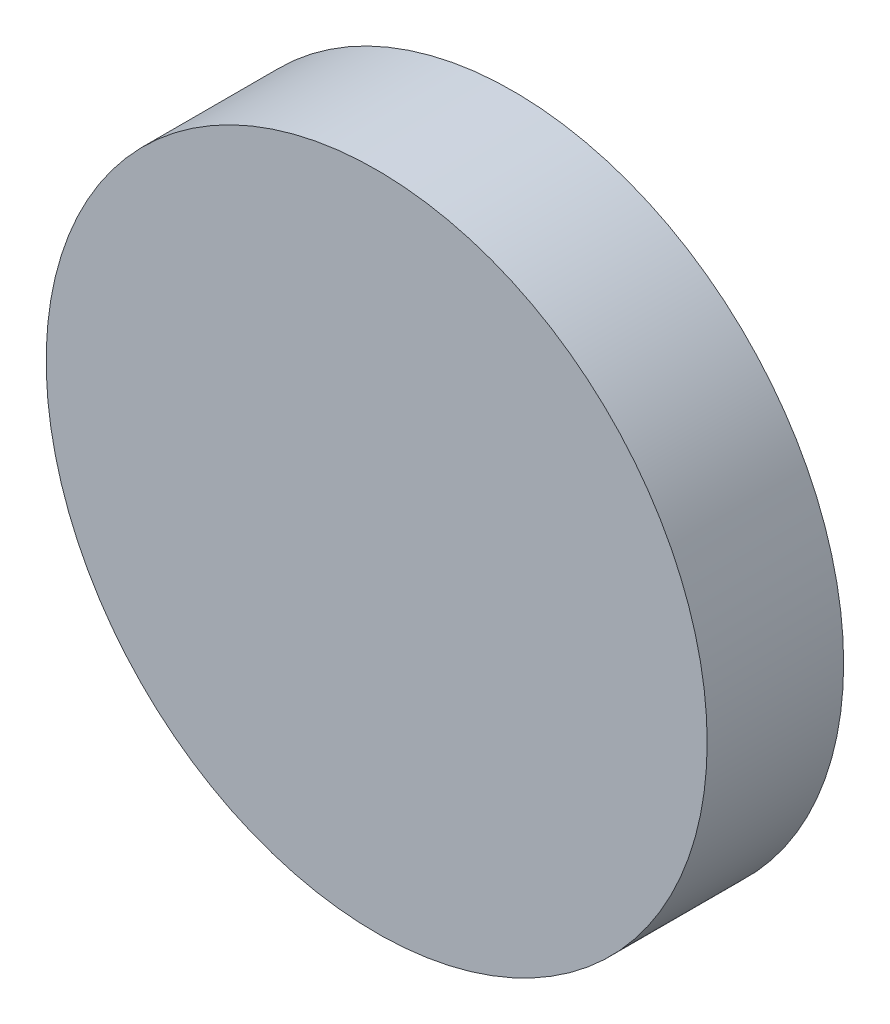
ISO-10303-21;
HEADER;
FILE_DESCRIPTION(('STEP AP214'),'2;1');
FILE_NAME('part.step','',(''),(''),'','','');
FILE_SCHEMA(('AUTOMOTIVE_DESIGN { 1 0 10303 214 1 1 1 1 }'));
ENDSEC;
DATA;
#1=APPLICATION_CONTEXT('core data for automotive mechanical design processes');
#2=APPLICATION_PROTOCOL_DEFINITION('international standard','automotive_design',2000,#1);
#3=PRODUCT_CONTEXT('',#1,'mechanical');
#4=PRODUCT('Part','Part','',(#3));
#5=PRODUCT_RELATED_PRODUCT_CATEGORY('part','',(#4));
#6=PRODUCT_DEFINITION_FORMATION('','',#4);
#7=PRODUCT_DEFINITION_CONTEXT('part definition',#1,'design');
#8=PRODUCT_DEFINITION('design','',#6,#7);
#9=PRODUCT_DEFINITION_SHAPE('','',#8);
#10=(LENGTH_UNIT() NAMED_UNIT(*) SI_UNIT(.MILLI.,.METRE.));
#11=(NAMED_UNIT(*) PLANE_ANGLE_UNIT() SI_UNIT($,.RADIAN.));
#12=(NAMED_UNIT(*) SI_UNIT($,.STERADIAN.) SOLID_ANGLE_UNIT());
#13=UNCERTAINTY_MEASURE_WITH_UNIT(LENGTH_MEASURE(1.E-05),#10,'distance_accuracy_value','');
#14=(GEOMETRIC_REPRESENTATION_CONTEXT(3) GLOBAL_UNCERTAINTY_ASSIGNED_CONTEXT((#13)) GLOBAL_UNIT_ASSIGNED_CONTEXT((#10,
#11,#12)) REPRESENTATION_CONTEXT('',''));
#15=CARTESIAN_POINT('',(0.,0.,0.));
#16=DIRECTION('',(0.,0.,1.));
#17=DIRECTION('',(1.,0.,0.));
#18=AXIS2_PLACEMENT_3D('',#15,#16,#17);
#19=CARTESIAN_POINT('',(38.481,-19.05,7.9375));
#20=DIRECTION('',(0.,0.,-1.));
#21=DIRECTION('',(-1.,0.,0.));
#22=AXIS2_PLACEMENT_3D('',#19,#20,#21);
#23=CYLINDRICAL_SURFACE('',#22,38.44925);
#24=CARTESIAN_POINT('',(38.481,-19.05,7.9375));
#25=DIRECTION('',(0.,0.,1.));
#26=DIRECTION('',(1.,0.,0.));
#27=AXIS2_PLACEMENT_3D('',#24,#25,#26);
#28=CIRCLE('',#27,38.44925);
#29=CARTESIAN_POINT('',(76.93025,-19.05,7.9375));
#30=VERTEX_POINT('',#29);
#31=EDGE_CURVE('E10',#30,#30,#28,.T.);
#32=ORIENTED_EDGE('',*,*,#31,.F.);
#33=EDGE_LOOP('',(#32));
#34=FACE_BOUND('',#33,.T.);
#35=CARTESIAN_POINT('',(38.481,-19.05,-7.9375));
#36=DIRECTION('',(0.,0.,1.));
#37=DIRECTION('',(1.,0.,0.));
#38=AXIS2_PLACEMENT_3D('',#35,#36,#37);
#39=CIRCLE('',#38,38.44925);
#40=CARTESIAN_POINT('',(76.93025,-19.05,-7.9375));
#41=VERTEX_POINT('',#40);
#42=EDGE_CURVE('E44',#41,#41,#39,.T.);
#43=ORIENTED_EDGE('',*,*,#42,.T.);
#44=EDGE_LOOP('',(#43));
#45=FACE_BOUND('',#44,.T.);
#46=ADVANCED_FACE('F41',(#34,#45),#23,.T.);
#47=CARTESIAN_POINT('',(38.481,-19.05,7.9375));
#48=DIRECTION('',(0.,0.,1.));
#49=DIRECTION('',(1.,0.,0.));
#50=AXIS2_PLACEMENT_3D('',#47,#48,#49);
#51=PLANE('',#50);
#52=ORIENTED_EDGE('',*,*,#31,.T.);
#53=EDGE_LOOP('',(#52));
#54=FACE_BOUND('',#53,.T.);
#55=ADVANCED_FACE('F56',(#54),#51,.T.);
#56=CARTESIAN_POINT('',(38.481,-19.05,-7.9375));
#57=DIRECTION('',(0.,0.,1.));
#58=DIRECTION('',(1.,0.,0.));
#59=AXIS2_PLACEMENT_3D('',#56,#57,#58);
#60=PLANE('',#59);
#61=ORIENTED_EDGE('',*,*,#42,.F.);
#62=EDGE_LOOP('',(#61));
#63=FACE_BOUND('',#62,.T.);
#64=ADVANCED_FACE('F54',(#63),#60,.F.);
#65=CLOSED_SHELL('',(#46,#55,#64));
#66=MANIFOLD_SOLID_BREP('B2',#65);
#67=ADVANCED_BREP_SHAPE_REPRESENTATION('',(#18,#66),#14);
#68=SHAPE_DEFINITION_REPRESENTATION(#9,#67);
ENDSEC;
END-ISO-10303-21;
